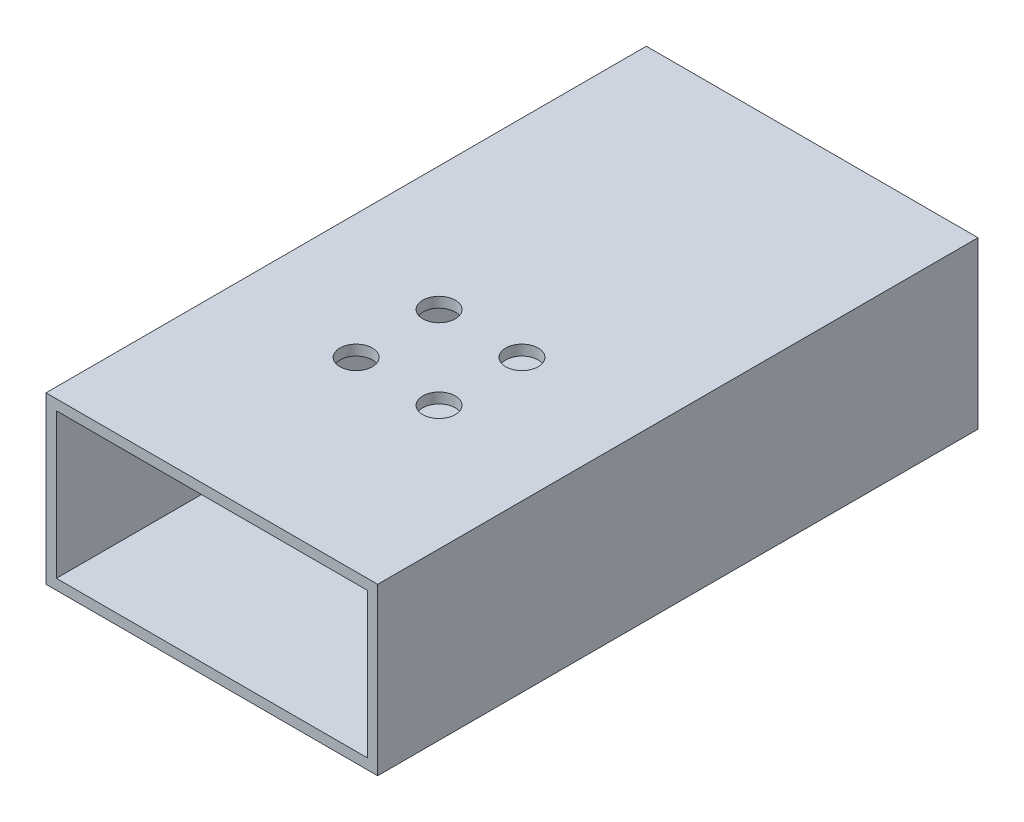
ISO-10303-21;
HEADER;
FILE_DESCRIPTION(('STEP AP214'),'2;1');
FILE_NAME('part.step','',(''),(''),'','','');
FILE_SCHEMA(('AUTOMOTIVE_DESIGN { 1 0 10303 214 1 1 1 1 }'));
ENDSEC;
DATA;
#1=APPLICATION_CONTEXT('core data for automotive mechanical design processes');
#2=APPLICATION_PROTOCOL_DEFINITION('international standard','automotive_design',2000,#1);
#3=PRODUCT_CONTEXT('',#1,'mechanical');
#4=PRODUCT('Part','Part','',(#3));
#5=PRODUCT_RELATED_PRODUCT_CATEGORY('part','',(#4));
#6=PRODUCT_DEFINITION_FORMATION('','',#4);
#7=PRODUCT_DEFINITION_CONTEXT('part definition',#1,'design');
#8=PRODUCT_DEFINITION('design','',#6,#7);
#9=PRODUCT_DEFINITION_SHAPE('','',#8);
#10=(LENGTH_UNIT() NAMED_UNIT(*) SI_UNIT(.MILLI.,.METRE.));
#11=(NAMED_UNIT(*) PLANE_ANGLE_UNIT() SI_UNIT($,.RADIAN.));
#12=(NAMED_UNIT(*) SI_UNIT($,.STERADIAN.) SOLID_ANGLE_UNIT());
#13=UNCERTAINTY_MEASURE_WITH_UNIT(LENGTH_MEASURE(1.E-05),#10,'distance_accuracy_value','');
#14=(GEOMETRIC_REPRESENTATION_CONTEXT(3) GLOBAL_UNCERTAINTY_ASSIGNED_CONTEXT((#13)) GLOBAL_UNIT_ASSIGNED_CONTEXT((#10,
#11,#12)) REPRESENTATION_CONTEXT('',''));
#15=CARTESIAN_POINT('',(0.,0.,0.));
#16=DIRECTION('',(0.,0.,1.));
#17=DIRECTION('',(1.,0.,0.));
#18=AXIS2_PLACEMENT_3D('',#15,#16,#17);
#19=CARTESIAN_POINT('',(0.,0.,45.974));
#20=DIRECTION('',(0.,0.,-1.));
#21=DIRECTION('',(-1.,0.,0.));
#22=AXIS2_PLACEMENT_3D('',#19,#20,#21);
#23=PLANE('',#22);
#24=DIRECTION('',(0.,1.,0.));
#25=VECTOR('',#24,1.);
#26=CARTESIAN_POINT('',(25.4,-12.7,45.974));
#27=LINE('',#26,#25);
#28=CARTESIAN_POINT('',(25.4,-12.7,45.974));
#29=VERTEX_POINT('',#28);
#30=CARTESIAN_POINT('',(25.4,12.7,45.974));
#31=VERTEX_POINT('',#30);
#32=EDGE_CURVE('E162',#29,#31,#27,.T.);
#33=ORIENTED_EDGE('',*,*,#32,.T.);
#34=DIRECTION('',(-1.,0.,0.));
#35=VECTOR('',#34,1.);
#36=CARTESIAN_POINT('',(-25.4,12.7,45.974));
#37=LINE('',#36,#35);
#38=CARTESIAN_POINT('',(-25.4,12.7,45.974));
#39=VERTEX_POINT('',#38);
#40=EDGE_CURVE('E166',#31,#39,#37,.T.);
#41=ORIENTED_EDGE('',*,*,#40,.T.);
#42=DIRECTION('',(0.,-1.,0.));
#43=VECTOR('',#42,1.);
#44=CARTESIAN_POINT('',(-25.4,-12.7,45.974));
#45=LINE('',#44,#43);
#46=CARTESIAN_POINT('',(-25.4,-12.7,45.974));
#47=VERTEX_POINT('',#46);
#48=EDGE_CURVE('E170',#39,#47,#45,.T.);
#49=ORIENTED_EDGE('',*,*,#48,.T.);
#50=DIRECTION('',(1.,0.,0.));
#51=VECTOR('',#50,1.);
#52=CARTESIAN_POINT('',(-25.4,-12.7,45.974));
#53=LINE('',#52,#51);
#54=EDGE_CURVE('E173',#47,#29,#53,.T.);
#55=ORIENTED_EDGE('',*,*,#54,.T.);
#56=EDGE_LOOP('',(#33,#41,#49,#55));
#57=FACE_BOUND('',#56,.T.);
#58=DIRECTION('',(0.,1.,0.));
#59=VECTOR('',#58,1.);
#60=CARTESIAN_POINT('',(23.8125,-11.1125,45.974));
#61=LINE('',#60,#59);
#62=CARTESIAN_POINT('',(23.8125,-11.1125,45.974));
#63=VERTEX_POINT('',#62);
#64=CARTESIAN_POINT('',(23.8125,11.1125,45.974));
#65=VERTEX_POINT('',#64);
#66=EDGE_CURVE('E112',#63,#65,#61,.T.);
#67=ORIENTED_EDGE('',*,*,#66,.F.);
#68=DIRECTION('',(1.,0.,0.));
#69=VECTOR('',#68,1.);
#70=CARTESIAN_POINT('',(-23.8125,-11.1125,45.974));
#71=LINE('',#70,#69);
#72=CARTESIAN_POINT('',(-23.8125,-11.1125,45.974));
#73=VERTEX_POINT('',#72);
#74=EDGE_CURVE('E138',#73,#63,#71,.T.);
#75=ORIENTED_EDGE('',*,*,#74,.F.);
#76=DIRECTION('',(0.,-1.,0.));
#77=VECTOR('',#76,1.);
#78=CARTESIAN_POINT('',(-23.8125,-11.1125,45.974));
#79=LINE('',#78,#77);
#80=CARTESIAN_POINT('',(-23.8125,11.1125,45.974));
#81=VERTEX_POINT('',#80);
#82=EDGE_CURVE('E134',#81,#73,#79,.T.);
#83=ORIENTED_EDGE('',*,*,#82,.F.);
#84=DIRECTION('',(-1.,0.,0.));
#85=VECTOR('',#84,1.);
#86=CARTESIAN_POINT('',(-23.8125,11.1125,45.974));
#87=LINE('',#86,#85);
#88=EDGE_CURVE('E121',#65,#81,#87,.T.);
#89=ORIENTED_EDGE('',*,*,#88,.F.);
#90=EDGE_LOOP('',(#67,#75,#83,#89));
#91=FACE_BOUND('',#90,.T.);
#92=ADVANCED_FACE('F44',(#57,#91),#23,.F.);
#93=CARTESIAN_POINT('',(0.,0.,-45.974));
#94=DIRECTION('',(0.,0.,-1.));
#95=DIRECTION('',(-1.,0.,0.));
#96=AXIS2_PLACEMENT_3D('',#93,#94,#95);
#97=PLANE('',#96);
#98=DIRECTION('',(0.,1.,0.));
#99=VECTOR('',#98,1.);
#100=CARTESIAN_POINT('',(25.4,-12.7,-45.974));
#101=LINE('',#100,#99);
#102=CARTESIAN_POINT('',(25.4,-12.7,-45.974));
#103=VERTEX_POINT('',#102);
#104=CARTESIAN_POINT('',(25.4,12.7,-45.974));
#105=VERTEX_POINT('',#104);
#106=EDGE_CURVE('E130',#103,#105,#101,.T.);
#107=ORIENTED_EDGE('',*,*,#106,.F.);
#108=DIRECTION('',(1.,0.,0.));
#109=VECTOR('',#108,1.);
#110=CARTESIAN_POINT('',(-25.4,-12.7,-45.974));
#111=LINE('',#110,#109);
#112=CARTESIAN_POINT('',(-25.4,-12.7,-45.974));
#113=VERTEX_POINT('',#112);
#114=EDGE_CURVE('E167',#113,#103,#111,.T.);
#115=ORIENTED_EDGE('',*,*,#114,.F.);
#116=DIRECTION('',(0.,-1.,0.));
#117=VECTOR('',#116,1.);
#118=CARTESIAN_POINT('',(-25.4,-12.7,-45.974));
#119=LINE('',#118,#117);
#120=CARTESIAN_POINT('',(-25.4,12.7,-45.974));
#121=VERTEX_POINT('',#120);
#122=EDGE_CURVE('E183',#121,#113,#119,.T.);
#123=ORIENTED_EDGE('',*,*,#122,.F.);
#124=DIRECTION('',(-1.,0.,0.));
#125=VECTOR('',#124,1.);
#126=CARTESIAN_POINT('',(-25.4,12.7,-45.974));
#127=LINE('',#126,#125);
#128=EDGE_CURVE('E180',#105,#121,#127,.T.);
#129=ORIENTED_EDGE('',*,*,#128,.F.);
#130=EDGE_LOOP('',(#107,#115,#123,#129));
#131=FACE_BOUND('',#130,.T.);
#132=DIRECTION('',(1.,0.,0.));
#133=VECTOR('',#132,1.);
#134=CARTESIAN_POINT('',(-23.8125,-11.1125,-45.974));
#135=LINE('',#134,#133);
#136=CARTESIAN_POINT('',(-23.8125,-11.1125,-45.974));
#137=VERTEX_POINT('',#136);
#138=CARTESIAN_POINT('',(23.8125,-11.1125,-45.974));
#139=VERTEX_POINT('',#138);
#140=EDGE_CURVE('E122',#137,#139,#135,.T.);
#141=ORIENTED_EDGE('',*,*,#140,.T.);
#142=DIRECTION('',(0.,1.,0.));
#143=VECTOR('',#142,1.);
#144=CARTESIAN_POINT('',(23.8125,-11.1125,-45.974));
#145=LINE('',#144,#143);
#146=CARTESIAN_POINT('',(23.8125,11.1125,-45.974));
#147=VERTEX_POINT('',#146);
#148=EDGE_CURVE('E70',#139,#147,#145,.T.);
#149=ORIENTED_EDGE('',*,*,#148,.T.);
#150=DIRECTION('',(-1.,0.,0.));
#151=VECTOR('',#150,1.);
#152=CARTESIAN_POINT('',(-23.8125,11.1125,-45.974));
#153=LINE('',#152,#151);
#154=CARTESIAN_POINT('',(-23.8125,11.1125,-45.974));
#155=VERTEX_POINT('',#154);
#156=EDGE_CURVE('E128',#147,#155,#153,.T.);
#157=ORIENTED_EDGE('',*,*,#156,.T.);
#158=DIRECTION('',(0.,-1.,0.));
#159=VECTOR('',#158,1.);
#160=CARTESIAN_POINT('',(-23.8125,-11.1125,-45.974));
#161=LINE('',#160,#159);
#162=EDGE_CURVE('E149',#155,#137,#161,.T.);
#163=ORIENTED_EDGE('',*,*,#162,.T.);
#164=EDGE_LOOP('',(#141,#149,#157,#163));
#165=FACE_BOUND('',#164,.T.);
#166=ADVANCED_FACE('F247',(#131,#165),#97,.T.);
#167=CARTESIAN_POINT('',(25.4,-12.7,45.974));
#168=DIRECTION('',(-1.,0.,0.));
#169=DIRECTION('',(0.,0.,1.));
#170=AXIS2_PLACEMENT_3D('',#167,#168,#169);
#171=PLANE('',#170);
#172=ORIENTED_EDGE('',*,*,#106,.T.);
#173=DIRECTION('',(0.,0.,-1.));
#174=VECTOR('',#173,1.);
#175=CARTESIAN_POINT('',(25.4,12.7,45.974));
#176=LINE('',#175,#174);
#177=EDGE_CURVE('E11',#31,#105,#176,.T.);
#178=ORIENTED_EDGE('',*,*,#177,.F.);
#179=ORIENTED_EDGE('',*,*,#32,.F.);
#180=DIRECTION('',(0.,0.,-1.));
#181=VECTOR('',#180,1.);
#182=CARTESIAN_POINT('',(25.4,-12.7,45.974));
#183=LINE('',#182,#181);
#184=EDGE_CURVE('E176',#29,#103,#183,.T.);
#185=ORIENTED_EDGE('',*,*,#184,.T.);
#186=EDGE_LOOP('',(#172,#178,#179,#185));
#187=FACE_BOUND('',#186,.T.);
#188=ADVANCED_FACE('F46',(#187),#171,.F.);
#189=CARTESIAN_POINT('',(-25.4,12.7,45.974));
#190=DIRECTION('',(0.,-1.,0.));
#191=DIRECTION('',(0.,0.,-1.));
#192=AXIS2_PLACEMENT_3D('',#189,#190,#191);
#193=PLANE('',#192);
#194=CARTESIAN_POINT('',(6.35,12.7,4.826));
#195=DIRECTION('',(0.,1.,0.));
#196=DIRECTION('',(0.,0.,1.));
#197=AXIS2_PLACEMENT_3D('',#194,#195,#196);
#198=CIRCLE('',#197,2.4892);
#199=CARTESIAN_POINT('',(6.35,12.7,7.3152));
#200=VERTEX_POINT('',#199);
#201=EDGE_CURVE('E284',#200,#200,#198,.T.);
#202=ORIENTED_EDGE('',*,*,#201,.F.);
#203=EDGE_LOOP('',(#202));
#204=FACE_BOUND('',#203,.T.);
#205=CARTESIAN_POINT('',(-6.35,12.7,17.526));
#206=DIRECTION('',(0.,1.,0.));
#207=DIRECTION('',(0.,0.,1.));
#208=AXIS2_PLACEMENT_3D('',#205,#206,#207);
#209=CIRCLE('',#208,2.4892);
#210=CARTESIAN_POINT('',(-6.35,12.7,20.0152));
#211=VERTEX_POINT('',#210);
#212=EDGE_CURVE('E288',#211,#211,#209,.T.);
#213=ORIENTED_EDGE('',*,*,#212,.F.);
#214=EDGE_LOOP('',(#213));
#215=FACE_BOUND('',#214,.T.);
#216=CARTESIAN_POINT('',(6.35,12.7,17.526));
#217=DIRECTION('',(0.,1.,0.));
#218=DIRECTION('',(0.,0.,1.));
#219=AXIS2_PLACEMENT_3D('',#216,#217,#218);
#220=CIRCLE('',#219,2.4892);
#221=CARTESIAN_POINT('',(6.35,12.7,20.0152));
#222=VERTEX_POINT('',#221);
#223=EDGE_CURVE('E292',#222,#222,#220,.T.);
#224=ORIENTED_EDGE('',*,*,#223,.F.);
#225=EDGE_LOOP('',(#224));
#226=FACE_BOUND('',#225,.T.);
#227=CARTESIAN_POINT('',(-6.35,12.7,4.826));
#228=DIRECTION('',(0.,1.,0.));
#229=DIRECTION('',(0.,0.,1.));
#230=AXIS2_PLACEMENT_3D('',#227,#228,#229);
#231=CIRCLE('',#230,2.4892);
#232=CARTESIAN_POINT('',(-6.35,12.7,7.3152));
#233=VERTEX_POINT('',#232);
#234=EDGE_CURVE('E296',#233,#233,#231,.T.);
#235=ORIENTED_EDGE('',*,*,#234,.F.);
#236=EDGE_LOOP('',(#235));
#237=FACE_BOUND('',#236,.T.);
#238=ORIENTED_EDGE('',*,*,#128,.T.);
#239=DIRECTION('',(0.,0.,-1.));
#240=VECTOR('',#239,1.);
#241=CARTESIAN_POINT('',(-25.4,12.7,45.974));
#242=LINE('',#241,#240);
#243=EDGE_CURVE('E54',#39,#121,#242,.T.);
#244=ORIENTED_EDGE('',*,*,#243,.F.);
#245=ORIENTED_EDGE('',*,*,#40,.F.);
#246=ORIENTED_EDGE('',*,*,#177,.T.);
#247=EDGE_LOOP('',(#238,#244,#245,#246));
#248=FACE_BOUND('',#247,.T.);
#249=ADVANCED_FACE('F274',(#204,#215,#226,#237,#248),#193,.F.);
#250=CARTESIAN_POINT('',(-25.4,-12.7,45.974));
#251=DIRECTION('',(1.,0.,0.));
#252=DIRECTION('',(0.,0.,-1.));
#253=AXIS2_PLACEMENT_3D('',#250,#251,#252);
#254=PLANE('',#253);
#255=ORIENTED_EDGE('',*,*,#122,.T.);
#256=DIRECTION('',(0.,0.,-1.));
#257=VECTOR('',#256,1.);
#258=CARTESIAN_POINT('',(-25.4,-12.7,45.974));
#259=LINE('',#258,#257);
#260=EDGE_CURVE('E191',#47,#113,#259,.T.);
#261=ORIENTED_EDGE('',*,*,#260,.F.);
#262=ORIENTED_EDGE('',*,*,#48,.F.);
#263=ORIENTED_EDGE('',*,*,#243,.T.);
#264=EDGE_LOOP('',(#255,#261,#262,#263));
#265=FACE_BOUND('',#264,.T.);
#266=ADVANCED_FACE('F271',(#265),#254,.F.);
#267=CARTESIAN_POINT('',(-25.4,-12.7,45.974));
#268=DIRECTION('',(0.,1.,0.));
#269=DIRECTION('',(0.,0.,1.));
#270=AXIS2_PLACEMENT_3D('',#267,#268,#269);
#271=PLANE('',#270);
#272=CARTESIAN_POINT('',(6.35,-12.7,4.826));
#273=DIRECTION('',(0.,1.,0.));
#274=DIRECTION('',(0.,0.,1.));
#275=AXIS2_PLACEMENT_3D('',#272,#273,#274);
#276=CIRCLE('',#275,2.4892);
#277=CARTESIAN_POINT('',(6.35,-12.7,7.3152));
#278=VERTEX_POINT('',#277);
#279=EDGE_CURVE('E314',#278,#278,#276,.T.);
#280=ORIENTED_EDGE('',*,*,#279,.T.);
#281=EDGE_LOOP('',(#280));
#282=FACE_BOUND('',#281,.T.);
#283=CARTESIAN_POINT('',(-6.35,-12.7,17.526));
#284=DIRECTION('',(0.,1.,0.));
#285=DIRECTION('',(0.,0.,1.));
#286=AXIS2_PLACEMENT_3D('',#283,#284,#285);
#287=CIRCLE('',#286,2.4892);
#288=CARTESIAN_POINT('',(-6.35,-12.7,20.0152));
#289=VERTEX_POINT('',#288);
#290=EDGE_CURVE('E317',#289,#289,#287,.T.);
#291=ORIENTED_EDGE('',*,*,#290,.T.);
#292=EDGE_LOOP('',(#291));
#293=FACE_BOUND('',#292,.T.);
#294=CARTESIAN_POINT('',(6.35,-12.7,17.526));
#295=DIRECTION('',(0.,1.,0.));
#296=DIRECTION('',(0.,0.,1.));
#297=AXIS2_PLACEMENT_3D('',#294,#295,#296);
#298=CIRCLE('',#297,2.4892);
#299=CARTESIAN_POINT('',(6.35,-12.7,20.0152));
#300=VERTEX_POINT('',#299);
#301=EDGE_CURVE('E326',#300,#300,#298,.T.);
#302=ORIENTED_EDGE('',*,*,#301,.T.);
#303=EDGE_LOOP('',(#302));
#304=FACE_BOUND('',#303,.T.);
#305=CARTESIAN_POINT('',(-6.35,-12.7,4.826));
#306=DIRECTION('',(0.,1.,0.));
#307=DIRECTION('',(0.,0.,1.));
#308=AXIS2_PLACEMENT_3D('',#305,#306,#307);
#309=CIRCLE('',#308,2.4892);
#310=CARTESIAN_POINT('',(-6.35,-12.7,7.3152));
#311=VERTEX_POINT('',#310);
#312=EDGE_CURVE('E203',#311,#311,#309,.T.);
#313=ORIENTED_EDGE('',*,*,#312,.T.);
#314=EDGE_LOOP('',(#313));
#315=FACE_BOUND('',#314,.T.);
#316=ORIENTED_EDGE('',*,*,#114,.T.);
#317=ORIENTED_EDGE('',*,*,#184,.F.);
#318=ORIENTED_EDGE('',*,*,#54,.F.);
#319=ORIENTED_EDGE('',*,*,#260,.T.);
#320=EDGE_LOOP('',(#316,#317,#318,#319));
#321=FACE_BOUND('',#320,.T.);
#322=ADVANCED_FACE('F268',(#282,#293,#304,#315,#321),#271,.F.);
#323=CARTESIAN_POINT('',(23.8125,-11.1125,45.974));
#324=DIRECTION('',(-1.,0.,0.));
#325=DIRECTION('',(0.,0.,1.));
#326=AXIS2_PLACEMENT_3D('',#323,#324,#325);
#327=PLANE('',#326);
#328=ORIENTED_EDGE('',*,*,#148,.F.);
#329=DIRECTION('',(0.,0.,-1.));
#330=VECTOR('',#329,1.);
#331=CARTESIAN_POINT('',(23.8125,-11.1125,45.974));
#332=LINE('',#331,#330);
#333=EDGE_CURVE('E116',#63,#139,#332,.T.);
#334=ORIENTED_EDGE('',*,*,#333,.F.);
#335=ORIENTED_EDGE('',*,*,#66,.T.);
#336=DIRECTION('',(0.,0.,-1.));
#337=VECTOR('',#336,1.);
#338=CARTESIAN_POINT('',(23.8125,11.1125,45.974));
#339=LINE('',#338,#337);
#340=EDGE_CURVE('E115',#65,#147,#339,.T.);
#341=ORIENTED_EDGE('',*,*,#340,.T.);
#342=EDGE_LOOP('',(#328,#334,#335,#341));
#343=FACE_BOUND('',#342,.T.);
#344=ADVANCED_FACE('F114',(#343),#327,.T.);
#345=CARTESIAN_POINT('',(-23.8125,11.1125,45.974));
#346=DIRECTION('',(0.,-1.,0.));
#347=DIRECTION('',(0.,0.,-1.));
#348=AXIS2_PLACEMENT_3D('',#345,#346,#347);
#349=PLANE('',#348);
#350=CARTESIAN_POINT('',(6.35,11.1125,4.826));
#351=DIRECTION('',(0.,-1.,0.));
#352=DIRECTION('',(0.,0.,-1.));
#353=AXIS2_PLACEMENT_3D('',#350,#351,#352);
#354=CIRCLE('',#353,2.4892);
#355=CARTESIAN_POINT('',(6.35,11.1125,2.3368));
#356=VERTEX_POINT('',#355);
#357=EDGE_CURVE('E146',#356,#356,#354,.T.);
#358=ORIENTED_EDGE('',*,*,#357,.F.);
#359=EDGE_LOOP('',(#358));
#360=FACE_BOUND('',#359,.T.);
#361=CARTESIAN_POINT('',(-6.35,11.1125,17.526));
#362=DIRECTION('',(0.,-1.,0.));
#363=DIRECTION('',(0.,0.,-1.));
#364=AXIS2_PLACEMENT_3D('',#361,#362,#363);
#365=CIRCLE('',#364,2.4892);
#366=CARTESIAN_POINT('',(-6.35,11.1125,15.0368));
#367=VERTEX_POINT('',#366);
#368=EDGE_CURVE('E211',#367,#367,#365,.T.);
#369=ORIENTED_EDGE('',*,*,#368,.F.);
#370=EDGE_LOOP('',(#369));
#371=FACE_BOUND('',#370,.T.);
#372=CARTESIAN_POINT('',(6.35,11.1125,17.526));
#373=DIRECTION('',(0.,-1.,0.));
#374=DIRECTION('',(0.,0.,-1.));
#375=AXIS2_PLACEMENT_3D('',#372,#373,#374);
#376=CIRCLE('',#375,2.4892);
#377=CARTESIAN_POINT('',(6.35,11.1125,15.0368));
#378=VERTEX_POINT('',#377);
#379=EDGE_CURVE('E207',#378,#378,#376,.T.);
#380=ORIENTED_EDGE('',*,*,#379,.F.);
#381=EDGE_LOOP('',(#380));
#382=FACE_BOUND('',#381,.T.);
#383=CARTESIAN_POINT('',(-6.35,11.1125,4.826));
#384=DIRECTION('',(0.,-1.,0.));
#385=DIRECTION('',(0.,0.,-1.));
#386=AXIS2_PLACEMENT_3D('',#383,#384,#385);
#387=CIRCLE('',#386,2.4892);
#388=CARTESIAN_POINT('',(-6.35,11.1125,2.3368));
#389=VERTEX_POINT('',#388);
#390=EDGE_CURVE('E202',#389,#389,#387,.T.);
#391=ORIENTED_EDGE('',*,*,#390,.F.);
#392=EDGE_LOOP('',(#391));
#393=FACE_BOUND('',#392,.T.);
#394=ORIENTED_EDGE('',*,*,#156,.F.);
#395=ORIENTED_EDGE('',*,*,#340,.F.);
#396=ORIENTED_EDGE('',*,*,#88,.T.);
#397=DIRECTION('',(0.,0.,-1.));
#398=VECTOR('',#397,1.);
#399=CARTESIAN_POINT('',(-23.8125,11.1125,45.974));
#400=LINE('',#399,#398);
#401=EDGE_CURVE('E131',#81,#155,#400,.T.);
#402=ORIENTED_EDGE('',*,*,#401,.T.);
#403=EDGE_LOOP('',(#394,#395,#396,#402));
#404=FACE_BOUND('',#403,.T.);
#405=ADVANCED_FACE('F125',(#360,#371,#382,#393,#404),#349,.T.);
#406=CARTESIAN_POINT('',(-23.8125,-11.1125,45.974));
#407=DIRECTION('',(1.,0.,0.));
#408=DIRECTION('',(0.,0.,-1.));
#409=AXIS2_PLACEMENT_3D('',#406,#407,#408);
#410=PLANE('',#409);
#411=ORIENTED_EDGE('',*,*,#162,.F.);
#412=ORIENTED_EDGE('',*,*,#401,.F.);
#413=ORIENTED_EDGE('',*,*,#82,.T.);
#414=DIRECTION('',(0.,0.,-1.));
#415=VECTOR('',#414,1.);
#416=CARTESIAN_POINT('',(-23.8125,-11.1125,45.974));
#417=LINE('',#416,#415);
#418=EDGE_CURVE('E62',#73,#137,#417,.T.);
#419=ORIENTED_EDGE('',*,*,#418,.T.);
#420=EDGE_LOOP('',(#411,#412,#413,#419));
#421=FACE_BOUND('',#420,.T.);
#422=ADVANCED_FACE('F239',(#421),#410,.T.);
#423=CARTESIAN_POINT('',(-23.8125,-11.1125,45.974));
#424=DIRECTION('',(0.,1.,0.));
#425=DIRECTION('',(0.,0.,1.));
#426=AXIS2_PLACEMENT_3D('',#423,#424,#425);
#427=PLANE('',#426);
#428=CARTESIAN_POINT('',(6.35,-11.1125,4.826));
#429=DIRECTION('',(0.,1.,0.));
#430=DIRECTION('',(0.,0.,1.));
#431=AXIS2_PLACEMENT_3D('',#428,#429,#430);
#432=CIRCLE('',#431,2.4892);
#433=CARTESIAN_POINT('',(6.35,-11.1125,7.3152));
#434=VERTEX_POINT('',#433);
#435=EDGE_CURVE('E48',#434,#434,#432,.T.);
#436=ORIENTED_EDGE('',*,*,#435,.F.);
#437=EDGE_LOOP('',(#436));
#438=FACE_BOUND('',#437,.T.);
#439=CARTESIAN_POINT('',(-6.35,-11.1125,17.526));
#440=DIRECTION('',(0.,1.,0.));
#441=DIRECTION('',(0.,0.,1.));
#442=AXIS2_PLACEMENT_3D('',#439,#440,#441);
#443=CIRCLE('',#442,2.4892);
#444=CARTESIAN_POINT('',(-6.35,-11.1125,20.0152));
#445=VERTEX_POINT('',#444);
#446=EDGE_CURVE('E208',#445,#445,#443,.T.);
#447=ORIENTED_EDGE('',*,*,#446,.F.);
#448=EDGE_LOOP('',(#447));
#449=FACE_BOUND('',#448,.T.);
#450=CARTESIAN_POINT('',(6.35,-11.1125,17.526));
#451=DIRECTION('',(0.,1.,0.));
#452=DIRECTION('',(0.,0.,1.));
#453=AXIS2_PLACEMENT_3D('',#450,#451,#452);
#454=CIRCLE('',#453,2.4892);
#455=CARTESIAN_POINT('',(6.35,-11.1125,20.0152));
#456=VERTEX_POINT('',#455);
#457=EDGE_CURVE('E204',#456,#456,#454,.T.);
#458=ORIENTED_EDGE('',*,*,#457,.F.);
#459=EDGE_LOOP('',(#458));
#460=FACE_BOUND('',#459,.T.);
#461=CARTESIAN_POINT('',(-6.35,-11.1125,4.826));
#462=DIRECTION('',(0.,1.,0.));
#463=DIRECTION('',(0.,0.,1.));
#464=AXIS2_PLACEMENT_3D('',#461,#462,#463);
#465=CIRCLE('',#464,2.4892);
#466=CARTESIAN_POINT('',(-6.35,-11.1125,7.3152));
#467=VERTEX_POINT('',#466);
#468=EDGE_CURVE('E198',#467,#467,#465,.T.);
#469=ORIENTED_EDGE('',*,*,#468,.F.);
#470=EDGE_LOOP('',(#469));
#471=FACE_BOUND('',#470,.T.);
#472=ORIENTED_EDGE('',*,*,#140,.F.);
#473=ORIENTED_EDGE('',*,*,#418,.F.);
#474=ORIENTED_EDGE('',*,*,#74,.T.);
#475=ORIENTED_EDGE('',*,*,#333,.T.);
#476=EDGE_LOOP('',(#472,#473,#474,#475));
#477=FACE_BOUND('',#476,.T.);
#478=ADVANCED_FACE('F235',(#438,#449,#460,#471,#477),#427,.T.);
#479=CARTESIAN_POINT('',(-6.35,-12.7,4.826));
#480=DIRECTION('',(0.,1.,0.));
#481=DIRECTION('',(0.,0.,1.));
#482=AXIS2_PLACEMENT_3D('',#479,#480,#481);
#483=CYLINDRICAL_SURFACE('',#482,2.4892);
#484=ORIENTED_EDGE('',*,*,#468,.T.);
#485=EDGE_LOOP('',(#484));
#486=FACE_BOUND('',#485,.T.);
#487=ORIENTED_EDGE('',*,*,#312,.F.);
#488=EDGE_LOOP('',(#487));
#489=FACE_BOUND('',#488,.T.);
#490=ADVANCED_FACE('F238',(#486,#489),#483,.F.);
#491=CARTESIAN_POINT('',(6.35,-12.7,17.526));
#492=DIRECTION('',(0.,1.,0.));
#493=DIRECTION('',(0.,0.,1.));
#494=AXIS2_PLACEMENT_3D('',#491,#492,#493);
#495=CYLINDRICAL_SURFACE('',#494,2.4892);
#496=ORIENTED_EDGE('',*,*,#457,.T.);
#497=EDGE_LOOP('',(#496));
#498=FACE_BOUND('',#497,.T.);
#499=ORIENTED_EDGE('',*,*,#301,.F.);
#500=EDGE_LOOP('',(#499));
#501=FACE_BOUND('',#500,.T.);
#502=ADVANCED_FACE('F337',(#498,#501),#495,.F.);
#503=CARTESIAN_POINT('',(-6.35,-12.7,17.526));
#504=DIRECTION('',(0.,1.,0.));
#505=DIRECTION('',(0.,0.,1.));
#506=AXIS2_PLACEMENT_3D('',#503,#504,#505);
#507=CYLINDRICAL_SURFACE('',#506,2.4892);
#508=ORIENTED_EDGE('',*,*,#446,.T.);
#509=EDGE_LOOP('',(#508));
#510=FACE_BOUND('',#509,.T.);
#511=ORIENTED_EDGE('',*,*,#290,.F.);
#512=EDGE_LOOP('',(#511));
#513=FACE_BOUND('',#512,.T.);
#514=ADVANCED_FACE('F345',(#510,#513),#507,.F.);
#515=CARTESIAN_POINT('',(6.35,-12.7,4.826));
#516=DIRECTION('',(0.,1.,0.));
#517=DIRECTION('',(0.,0.,1.));
#518=AXIS2_PLACEMENT_3D('',#515,#516,#517);
#519=CYLINDRICAL_SURFACE('',#518,2.4892);
#520=ORIENTED_EDGE('',*,*,#435,.T.);
#521=EDGE_LOOP('',(#520));
#522=FACE_BOUND('',#521,.T.);
#523=ORIENTED_EDGE('',*,*,#279,.F.);
#524=EDGE_LOOP('',(#523));
#525=FACE_BOUND('',#524,.T.);
#526=ADVANCED_FACE('F232',(#522,#525),#519,.F.);
#527=ORIENTED_EDGE('',*,*,#390,.T.);
#528=EDGE_LOOP('',(#527));
#529=FACE_BOUND('',#528,.T.);
#530=ORIENTED_EDGE('',*,*,#234,.T.);
#531=EDGE_LOOP('',(#530));
#532=FACE_BOUND('',#531,.T.);
#533=ADVANCED_FACE('F335',(#529,#532),#483,.F.);
#534=ORIENTED_EDGE('',*,*,#379,.T.);
#535=EDGE_LOOP('',(#534));
#536=FACE_BOUND('',#535,.T.);
#537=ORIENTED_EDGE('',*,*,#223,.T.);
#538=EDGE_LOOP('',(#537));
#539=FACE_BOUND('',#538,.T.);
#540=ADVANCED_FACE('F332',(#536,#539),#495,.F.);
#541=ORIENTED_EDGE('',*,*,#368,.T.);
#542=EDGE_LOOP('',(#541));
#543=FACE_BOUND('',#542,.T.);
#544=ORIENTED_EDGE('',*,*,#212,.T.);
#545=EDGE_LOOP('',(#544));
#546=FACE_BOUND('',#545,.T.);
#547=ADVANCED_FACE('F334',(#543,#546),#507,.F.);
#548=ORIENTED_EDGE('',*,*,#357,.T.);
#549=EDGE_LOOP('',(#548));
#550=FACE_BOUND('',#549,.T.);
#551=ORIENTED_EDGE('',*,*,#201,.T.);
#552=EDGE_LOOP('',(#551));
#553=FACE_BOUND('',#552,.T.);
#554=ADVANCED_FACE('F342',(#550,#553),#519,.F.);
#555=CLOSED_SHELL('',(#92,#166,#188,#249,#266,#322,#344,#405,#422,#478,#490,#502,#514,#526,#533,
#540,#547,#554));
#556=MANIFOLD_SOLID_BREP('B2',#555);
#557=ADVANCED_BREP_SHAPE_REPRESENTATION('',(#18,#556),#14);
#558=SHAPE_DEFINITION_REPRESENTATION(#9,#557);
ENDSEC;
END-ISO-10303-21;
